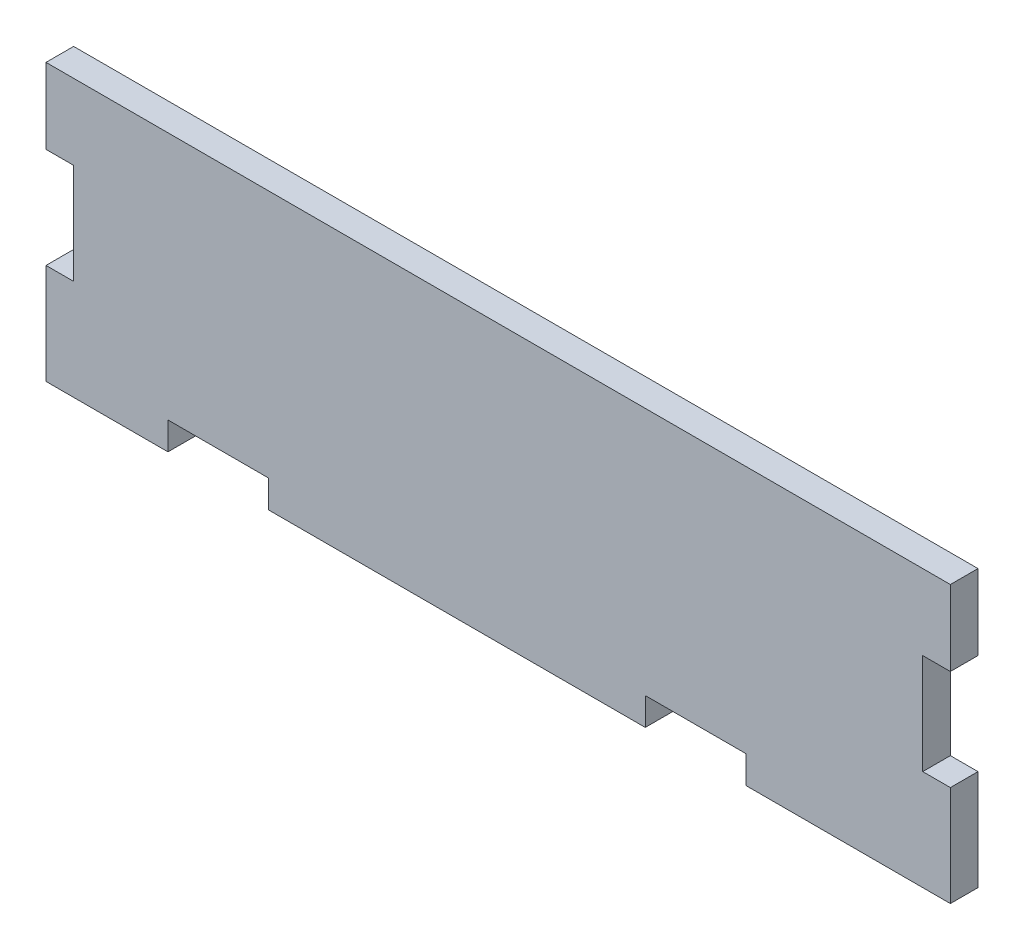
ISO-10303-21;
HEADER;
FILE_DESCRIPTION(('STEP AP214'),'2;1');
FILE_NAME('part.step','',(''),(''),'','','');
FILE_SCHEMA(('AUTOMOTIVE_DESIGN { 1 0 10303 214 1 1 1 1 }'));
ENDSEC;
DATA;
#1=APPLICATION_CONTEXT('core data for automotive mechanical design processes');
#2=APPLICATION_PROTOCOL_DEFINITION('international standard','automotive_design',2000,#1);
#3=PRODUCT_CONTEXT('',#1,'mechanical');
#4=PRODUCT('Part','Part','',(#3));
#5=PRODUCT_RELATED_PRODUCT_CATEGORY('part','',(#4));
#6=PRODUCT_DEFINITION_FORMATION('','',#4);
#7=PRODUCT_DEFINITION_CONTEXT('part definition',#1,'design');
#8=PRODUCT_DEFINITION('design','',#6,#7);
#9=PRODUCT_DEFINITION_SHAPE('','',#8);
#10=(LENGTH_UNIT() NAMED_UNIT(*) SI_UNIT(.MILLI.,.METRE.));
#11=(NAMED_UNIT(*) PLANE_ANGLE_UNIT() SI_UNIT($,.RADIAN.));
#12=(NAMED_UNIT(*) SI_UNIT($,.STERADIAN.) SOLID_ANGLE_UNIT());
#13=UNCERTAINTY_MEASURE_WITH_UNIT(LENGTH_MEASURE(1.E-05),#10,'distance_accuracy_value','');
#14=(GEOMETRIC_REPRESENTATION_CONTEXT(3) GLOBAL_UNCERTAINTY_ASSIGNED_CONTEXT((#13)) GLOBAL_UNIT_ASSIGNED_CONTEXT((#10,
#11,#12)) REPRESENTATION_CONTEXT('',''));
#15=CARTESIAN_POINT('',(0.,0.,0.));
#16=DIRECTION('',(0.,0.,1.));
#17=DIRECTION('',(1.,0.,0.));
#18=AXIS2_PLACEMENT_3D('',#15,#16,#17);
#19=CARTESIAN_POINT('',(8.22451854308681,20.0000000000037,5.5));
#20=DIRECTION('',(1.,0.,0.));
#21=DIRECTION('',(0.,1.,0.));
#22=AXIS2_PLACEMENT_3D('',#19,#20,#21);
#23=PLANE('',#22);
#24=DIRECTION('',(0.,-1.,0.));
#25=VECTOR('',#24,1.);
#26=CARTESIAN_POINT('',(8.22451854308681,20.0000000000037,0.));
#27=LINE('',#26,#25);
#28=CARTESIAN_POINT('',(8.22451854308681,20.0000000000037,0.));
#29=VERTEX_POINT('',#28);
#30=CARTESIAN_POINT('',(8.22451854308676,3.66330230039402E-12,0.));
#31=VERTEX_POINT('',#30);
#32=EDGE_CURVE('E213',#29,#31,#27,.T.);
#33=ORIENTED_EDGE('',*,*,#32,.T.);
#34=DIRECTION('',(0.,0.,-1.));
#35=VECTOR('',#34,1.);
#36=CARTESIAN_POINT('',(8.22451854308676,3.66330230039402E-12,5.5));
#37=LINE('',#36,#35);
#38=CARTESIAN_POINT('',(8.22451854308676,3.66330230039402E-12,5.5));
#39=VERTEX_POINT('',#38);
#40=EDGE_CURVE('E11',#39,#31,#37,.T.);
#41=ORIENTED_EDGE('',*,*,#40,.F.);
#42=DIRECTION('',(0.,-1.,0.));
#43=VECTOR('',#42,1.);
#44=CARTESIAN_POINT('',(8.22451854308681,20.0000000000037,5.5));
#45=LINE('',#44,#43);
#46=CARTESIAN_POINT('',(8.22451854308681,20.0000000000037,5.5));
#47=VERTEX_POINT('',#46);
#48=EDGE_CURVE('E252',#47,#39,#45,.T.);
#49=ORIENTED_EDGE('',*,*,#48,.F.);
#50=DIRECTION('',(0.,0.,-1.));
#51=VECTOR('',#50,1.);
#52=CARTESIAN_POINT('',(8.22451854308681,20.0000000000037,5.5));
#53=LINE('',#52,#51);
#54=EDGE_CURVE('E209',#47,#29,#53,.T.);
#55=ORIENTED_EDGE('',*,*,#54,.T.);
#56=EDGE_LOOP('',(#33,#41,#49,#55));
#57=FACE_BOUND('',#56,.T.);
#58=ADVANCED_FACE('F45',(#57),#23,.F.);
#59=CARTESIAN_POINT('',(8.22451854308676,3.66330230039402E-12,5.5));
#60=DIRECTION('',(0.,1.,0.));
#61=DIRECTION('',(-1.,0.,0.));
#62=AXIS2_PLACEMENT_3D('',#59,#60,#61);
#63=PLANE('',#62);
#64=DIRECTION('',(1.,0.,0.));
#65=VECTOR('',#64,1.);
#66=CARTESIAN_POINT('',(8.22451854308676,3.66330230039402E-12,0.));
#67=LINE('',#66,#65);
#68=CARTESIAN_POINT('',(32.5000000000004,3.66373598126302E-12,0.));
#69=VERTEX_POINT('',#68);
#70=EDGE_CURVE('E216',#31,#69,#67,.T.);
#71=ORIENTED_EDGE('',*,*,#70,.T.);
#72=DIRECTION('',(0.,0.,-1.));
#73=VECTOR('',#72,1.);
#74=CARTESIAN_POINT('',(32.5000000000004,3.66373598126302E-12,5.5));
#75=LINE('',#74,#73);
#76=CARTESIAN_POINT('',(32.5000000000004,3.66373598126302E-12,5.5));
#77=VERTEX_POINT('',#76);
#78=EDGE_CURVE('E53',#77,#69,#75,.T.);
#79=ORIENTED_EDGE('',*,*,#78,.F.);
#80=DIRECTION('',(1.,0.,0.));
#81=VECTOR('',#80,1.);
#82=CARTESIAN_POINT('',(8.22451854308676,3.66330230039402E-12,5.5));
#83=LINE('',#82,#81);
#84=EDGE_CURVE('E140',#39,#77,#83,.T.);
#85=ORIENTED_EDGE('',*,*,#84,.F.);
#86=ORIENTED_EDGE('',*,*,#40,.T.);
#87=EDGE_LOOP('',(#71,#79,#85,#86));
#88=FACE_BOUND('',#87,.T.);
#89=ADVANCED_FACE('F369',(#88),#63,.F.);
#90=CARTESIAN_POINT('',(32.5000000000004,5.50000000000302,5.5));
#91=DIRECTION('',(-1.,0.,0.));
#92=DIRECTION('',(0.,0.,1.));
#93=AXIS2_PLACEMENT_3D('',#90,#91,#92);
#94=PLANE('',#93);
#95=DIRECTION('',(0.,1.,0.));
#96=VECTOR('',#95,1.);
#97=CARTESIAN_POINT('',(32.5000000000004,5.50000000000302,0.));
#98=LINE('',#97,#96);
#99=CARTESIAN_POINT('',(32.5000000000004,5.50000000000302,0.));
#100=VERTEX_POINT('',#99);
#101=EDGE_CURVE('E218',#69,#100,#98,.T.);
#102=ORIENTED_EDGE('',*,*,#101,.T.);
#103=DIRECTION('',(0.,0.,-1.));
#104=VECTOR('',#103,1.);
#105=CARTESIAN_POINT('',(32.5000000000004,5.50000000000302,5.5));
#106=LINE('',#105,#104);
#107=CARTESIAN_POINT('',(32.5000000000004,5.50000000000302,5.5));
#108=VERTEX_POINT('',#107);
#109=EDGE_CURVE('E295',#108,#100,#106,.T.);
#110=ORIENTED_EDGE('',*,*,#109,.F.);
#111=DIRECTION('',(0.,1.,0.));
#112=VECTOR('',#111,1.);
#113=CARTESIAN_POINT('',(32.5000000000004,5.50000000000302,5.5));
#114=LINE('',#113,#112);
#115=EDGE_CURVE('E303',#77,#108,#114,.T.);
#116=ORIENTED_EDGE('',*,*,#115,.F.);
#117=ORIENTED_EDGE('',*,*,#78,.T.);
#118=EDGE_LOOP('',(#102,#110,#116,#117));
#119=FACE_BOUND('',#118,.T.);
#120=ADVANCED_FACE('F301',(#119),#94,.F.);
#121=CARTESIAN_POINT('',(32.5000000000004,5.50000000000302,5.5));
#122=DIRECTION('',(0.,1.,0.));
#123=DIRECTION('',(0.,0.,1.));
#124=AXIS2_PLACEMENT_3D('',#121,#122,#123);
#125=PLANE('',#124);
#126=DIRECTION('',(1.,0.,0.));
#127=VECTOR('',#126,1.);
#128=CARTESIAN_POINT('',(32.5000000000004,5.50000000000302,0.));
#129=LINE('',#128,#127);
#130=CARTESIAN_POINT('',(52.5000000000004,5.50000000000302,0.));
#131=VERTEX_POINT('',#130);
#132=EDGE_CURVE('E220',#100,#131,#129,.T.);
#133=ORIENTED_EDGE('',*,*,#132,.T.);
#134=DIRECTION('',(0.,0.,-1.));
#135=VECTOR('',#134,1.);
#136=CARTESIAN_POINT('',(52.5000000000004,5.50000000000302,5.5));
#137=LINE('',#136,#135);
#138=CARTESIAN_POINT('',(52.5000000000004,5.50000000000302,5.5));
#139=VERTEX_POINT('',#138);
#140=EDGE_CURVE('E292',#139,#131,#137,.T.);
#141=ORIENTED_EDGE('',*,*,#140,.F.);
#142=DIRECTION('',(1.,0.,0.));
#143=VECTOR('',#142,1.);
#144=CARTESIAN_POINT('',(32.5000000000004,5.50000000000302,5.5));
#145=LINE('',#144,#143);
#146=EDGE_CURVE('E320',#108,#139,#145,.T.);
#147=ORIENTED_EDGE('',*,*,#146,.F.);
#148=ORIENTED_EDGE('',*,*,#109,.T.);
#149=EDGE_LOOP('',(#133,#141,#147,#148));
#150=FACE_BOUND('',#149,.T.);
#151=ADVANCED_FACE('F311',(#150),#125,.F.);
#152=CARTESIAN_POINT('',(52.5000000000004,5.50000000000302,5.5));
#153=DIRECTION('',(1.,0.,0.));
#154=DIRECTION('',(0.,0.,-1.));
#155=AXIS2_PLACEMENT_3D('',#152,#153,#154);
#156=PLANE('',#155);
#157=DIRECTION('',(0.,-1.,0.));
#158=VECTOR('',#157,1.);
#159=CARTESIAN_POINT('',(52.5000000000004,5.50000000000302,0.));
#160=LINE('',#159,#158);
#161=CARTESIAN_POINT('',(52.5000000000004,3.66330230039402E-12,0.));
#162=VERTEX_POINT('',#161);
#163=EDGE_CURVE('E222',#131,#162,#160,.T.);
#164=ORIENTED_EDGE('',*,*,#163,.T.);
#165=DIRECTION('',(0.,0.,-1.));
#166=VECTOR('',#165,1.);
#167=CARTESIAN_POINT('',(52.5000000000004,3.66330230039402E-12,5.5));
#168=LINE('',#167,#166);
#169=CARTESIAN_POINT('',(52.5000000000004,3.66330230039402E-12,5.5));
#170=VERTEX_POINT('',#169);
#171=EDGE_CURVE('E289',#170,#162,#168,.T.);
#172=ORIENTED_EDGE('',*,*,#171,.F.);
#173=DIRECTION('',(0.,-1.,0.));
#174=VECTOR('',#173,1.);
#175=CARTESIAN_POINT('',(52.5000000000004,5.50000000000302,5.5));
#176=LINE('',#175,#174);
#177=EDGE_CURVE('E317',#139,#170,#176,.T.);
#178=ORIENTED_EDGE('',*,*,#177,.F.);
#179=ORIENTED_EDGE('',*,*,#140,.T.);
#180=EDGE_LOOP('',(#164,#172,#178,#179));
#181=FACE_BOUND('',#180,.T.);
#182=ADVANCED_FACE('F315',(#181),#156,.F.);
#183=CARTESIAN_POINT('',(100.,3.66330230039402E-12,5.5));
#184=DIRECTION('',(0.,1.,0.));
#185=DIRECTION('',(-1.,0.,0.));
#186=AXIS2_PLACEMENT_3D('',#183,#184,#185);
#187=PLANE('',#186);
#188=DIRECTION('',(1.,0.,0.));
#189=VECTOR('',#188,1.);
#190=CARTESIAN_POINT('',(100.,3.66330230039402E-12,0.));
#191=LINE('',#190,#189);
#192=CARTESIAN_POINT('',(127.5,3.66373598126302E-12,0.));
#193=VERTEX_POINT('',#192);
#194=EDGE_CURVE('E225',#162,#193,#191,.T.);
#195=ORIENTED_EDGE('',*,*,#194,.T.);
#196=DIRECTION('',(0.,0.,-1.));
#197=VECTOR('',#196,1.);
#198=CARTESIAN_POINT('',(127.5,3.66373598126302E-12,5.5));
#199=LINE('',#198,#197);
#200=CARTESIAN_POINT('',(127.5,3.66373598126302E-12,5.5));
#201=VERTEX_POINT('',#200);
#202=EDGE_CURVE('E286',#201,#193,#199,.T.);
#203=ORIENTED_EDGE('',*,*,#202,.F.);
#204=DIRECTION('',(1.,0.,0.));
#205=VECTOR('',#204,1.);
#206=CARTESIAN_POINT('',(52.5000000000004,3.66330230039402E-12,5.5));
#207=LINE('',#206,#205);
#208=EDGE_CURVE('E319',#170,#201,#207,.T.);
#209=ORIENTED_EDGE('',*,*,#208,.F.);
#210=ORIENTED_EDGE('',*,*,#171,.T.);
#211=EDGE_LOOP('',(#195,#203,#209,#210));
#212=FACE_BOUND('',#211,.T.);
#213=ADVANCED_FACE('F383',(#212),#187,.F.);
#214=CARTESIAN_POINT('',(127.5,5.50000000000303,5.5));
#215=DIRECTION('',(-1.,0.,0.));
#216=DIRECTION('',(0.,0.,1.));
#217=AXIS2_PLACEMENT_3D('',#214,#215,#216);
#218=PLANE('',#217);
#219=DIRECTION('',(0.,1.,0.));
#220=VECTOR('',#219,1.);
#221=CARTESIAN_POINT('',(127.5,5.50000000000303,0.));
#222=LINE('',#221,#220);
#223=CARTESIAN_POINT('',(127.5,5.50000000000303,0.));
#224=VERTEX_POINT('',#223);
#225=EDGE_CURVE('E227',#193,#224,#222,.T.);
#226=ORIENTED_EDGE('',*,*,#225,.T.);
#227=DIRECTION('',(0.,0.,-1.));
#228=VECTOR('',#227,1.);
#229=CARTESIAN_POINT('',(127.5,5.50000000000303,5.5));
#230=LINE('',#229,#228);
#231=CARTESIAN_POINT('',(127.5,5.50000000000303,5.5));
#232=VERTEX_POINT('',#231);
#233=EDGE_CURVE('E283',#232,#224,#230,.T.);
#234=ORIENTED_EDGE('',*,*,#233,.F.);
#235=DIRECTION('',(0.,1.,0.));
#236=VECTOR('',#235,1.);
#237=CARTESIAN_POINT('',(127.5,5.50000000000303,5.5));
#238=LINE('',#237,#236);
#239=EDGE_CURVE('E322',#201,#232,#238,.T.);
#240=ORIENTED_EDGE('',*,*,#239,.F.);
#241=ORIENTED_EDGE('',*,*,#202,.T.);
#242=EDGE_LOOP('',(#226,#234,#240,#241));
#243=FACE_BOUND('',#242,.T.);
#244=ADVANCED_FACE('F385',(#243),#218,.F.);
#245=CARTESIAN_POINT('',(127.5,5.50000000000303,5.5));
#246=DIRECTION('',(0.,1.,0.));
#247=DIRECTION('',(0.,0.,1.));
#248=AXIS2_PLACEMENT_3D('',#245,#246,#247);
#249=PLANE('',#248);
#250=DIRECTION('',(1.,0.,0.));
#251=VECTOR('',#250,1.);
#252=CARTESIAN_POINT('',(127.5,5.50000000000303,0.));
#253=LINE('',#252,#251);
#254=CARTESIAN_POINT('',(147.5,5.50000000000303,0.));
#255=VERTEX_POINT('',#254);
#256=EDGE_CURVE('E229',#224,#255,#253,.T.);
#257=ORIENTED_EDGE('',*,*,#256,.T.);
#258=DIRECTION('',(0.,0.,-1.));
#259=VECTOR('',#258,1.);
#260=CARTESIAN_POINT('',(147.5,5.50000000000303,5.5));
#261=LINE('',#260,#259);
#262=CARTESIAN_POINT('',(147.5,5.50000000000303,5.5));
#263=VERTEX_POINT('',#262);
#264=EDGE_CURVE('E280',#263,#255,#261,.T.);
#265=ORIENTED_EDGE('',*,*,#264,.F.);
#266=DIRECTION('',(1.,0.,0.));
#267=VECTOR('',#266,1.);
#268=CARTESIAN_POINT('',(127.5,5.50000000000303,5.5));
#269=LINE('',#268,#267);
#270=EDGE_CURVE('E328',#232,#263,#269,.T.);
#271=ORIENTED_EDGE('',*,*,#270,.F.);
#272=ORIENTED_EDGE('',*,*,#233,.T.);
#273=EDGE_LOOP('',(#257,#265,#271,#272));
#274=FACE_BOUND('',#273,.T.);
#275=ADVANCED_FACE('F389',(#274),#249,.F.);
#276=CARTESIAN_POINT('',(147.5,5.50000000000303,5.5));
#277=DIRECTION('',(1.,0.,0.));
#278=DIRECTION('',(0.,0.,-1.));
#279=AXIS2_PLACEMENT_3D('',#276,#277,#278);
#280=PLANE('',#279);
#281=DIRECTION('',(0.,-1.,0.));
#282=VECTOR('',#281,1.);
#283=CARTESIAN_POINT('',(147.5,5.50000000000303,0.));
#284=LINE('',#283,#282);
#285=CARTESIAN_POINT('',(147.5,3.66330230039402E-12,0.));
#286=VERTEX_POINT('',#285);
#287=EDGE_CURVE('E231',#255,#286,#284,.T.);
#288=ORIENTED_EDGE('',*,*,#287,.T.);
#289=DIRECTION('',(0.,0.,-1.));
#290=VECTOR('',#289,1.);
#291=CARTESIAN_POINT('',(147.5,3.66330230039402E-12,5.5));
#292=LINE('',#291,#290);
#293=CARTESIAN_POINT('',(147.5,3.66330230039402E-12,5.5));
#294=VERTEX_POINT('',#293);
#295=EDGE_CURVE('E277',#294,#286,#292,.T.);
#296=ORIENTED_EDGE('',*,*,#295,.F.);
#297=DIRECTION('',(0.,-1.,0.));
#298=VECTOR('',#297,1.);
#299=CARTESIAN_POINT('',(147.5,5.50000000000303,5.5));
#300=LINE('',#299,#298);
#301=EDGE_CURVE('E330',#263,#294,#300,.T.);
#302=ORIENTED_EDGE('',*,*,#301,.F.);
#303=ORIENTED_EDGE('',*,*,#264,.T.);
#304=EDGE_LOOP('',(#288,#296,#302,#303));
#305=FACE_BOUND('',#304,.T.);
#306=ADVANCED_FACE('F393',(#305),#280,.F.);
#307=CARTESIAN_POINT('',(147.5,3.66330230039402E-12,5.5));
#308=DIRECTION('',(0.,1.,0.));
#309=DIRECTION('',(0.,0.,1.));
#310=AXIS2_PLACEMENT_3D('',#307,#308,#309);
#311=PLANE('',#310);
#312=DIRECTION('',(1.,0.,0.));
#313=VECTOR('',#312,1.);
#314=CARTESIAN_POINT('',(147.5,3.66330230039402E-12,0.));
#315=LINE('',#314,#313);
#316=CARTESIAN_POINT('',(188.224518543087,3.66330230039402E-12,0.));
#317=VERTEX_POINT('',#316);
#318=EDGE_CURVE('E233',#286,#317,#315,.T.);
#319=ORIENTED_EDGE('',*,*,#318,.T.);
#320=DIRECTION('',(0.,0.,-1.));
#321=VECTOR('',#320,1.);
#322=CARTESIAN_POINT('',(188.224518543087,3.66330230039402E-12,5.5));
#323=LINE('',#322,#321);
#324=CARTESIAN_POINT('',(188.224518543087,3.66330230039402E-12,5.5));
#325=VERTEX_POINT('',#324);
#326=EDGE_CURVE('E274',#325,#317,#323,.T.);
#327=ORIENTED_EDGE('',*,*,#326,.F.);
#328=DIRECTION('',(1.,0.,0.));
#329=VECTOR('',#328,1.);
#330=CARTESIAN_POINT('',(147.5,3.66330230039402E-12,5.5));
#331=LINE('',#330,#329);
#332=EDGE_CURVE('E332',#294,#325,#331,.T.);
#333=ORIENTED_EDGE('',*,*,#332,.F.);
#334=ORIENTED_EDGE('',*,*,#295,.T.);
#335=EDGE_LOOP('',(#319,#327,#333,#334));
#336=FACE_BOUND('',#335,.T.);
#337=ADVANCED_FACE('F397',(#336),#311,.F.);
#338=CARTESIAN_POINT('',(188.224518543087,3.66330230039402E-12,5.5));
#339=DIRECTION('',(-1.,0.,0.));
#340=DIRECTION('',(0.,0.,1.));
#341=AXIS2_PLACEMENT_3D('',#338,#339,#340);
#342=PLANE('',#341);
#343=DIRECTION('',(0.,1.,0.));
#344=VECTOR('',#343,1.);
#345=CARTESIAN_POINT('',(188.224518543087,3.66330230039402E-12,0.));
#346=LINE('',#345,#344);
#347=CARTESIAN_POINT('',(188.224518543087,19.9999999999999,0.));
#348=VERTEX_POINT('',#347);
#349=EDGE_CURVE('E235',#317,#348,#346,.T.);
#350=ORIENTED_EDGE('',*,*,#349,.T.);
#351=DIRECTION('',(0.,0.,-1.));
#352=VECTOR('',#351,1.);
#353=CARTESIAN_POINT('',(188.224518543087,19.9999999999999,5.5));
#354=LINE('',#353,#352);
#355=CARTESIAN_POINT('',(188.224518543087,19.9999999999999,5.5));
#356=VERTEX_POINT('',#355);
#357=EDGE_CURVE('E271',#356,#348,#354,.T.);
#358=ORIENTED_EDGE('',*,*,#357,.F.);
#359=DIRECTION('',(0.,1.,0.));
#360=VECTOR('',#359,1.);
#361=CARTESIAN_POINT('',(188.224518543087,3.66330230039402E-12,5.5));
#362=LINE('',#361,#360);
#363=EDGE_CURVE('E334',#325,#356,#362,.T.);
#364=ORIENTED_EDGE('',*,*,#363,.F.);
#365=ORIENTED_EDGE('',*,*,#326,.T.);
#366=EDGE_LOOP('',(#350,#358,#364,#365));
#367=FACE_BOUND('',#366,.T.);
#368=ADVANCED_FACE('F401',(#367),#342,.F.);
#369=CARTESIAN_POINT('',(182.724518543087,19.9999999999999,5.5));
#370=DIRECTION('',(0.,-1.,0.));
#371=DIRECTION('',(0.,0.,-1.));
#372=AXIS2_PLACEMENT_3D('',#369,#370,#371);
#373=PLANE('',#372);
#374=DIRECTION('',(-1.,0.,0.));
#375=VECTOR('',#374,1.);
#376=CARTESIAN_POINT('',(182.724518543087,19.9999999999999,0.));
#377=LINE('',#376,#375);
#378=CARTESIAN_POINT('',(182.724518543087,19.9999999999999,0.));
#379=VERTEX_POINT('',#378);
#380=EDGE_CURVE('E237',#348,#379,#377,.T.);
#381=ORIENTED_EDGE('',*,*,#380,.T.);
#382=DIRECTION('',(0.,0.,-1.));
#383=VECTOR('',#382,1.);
#384=CARTESIAN_POINT('',(182.724518543087,19.9999999999999,5.5));
#385=LINE('',#384,#383);
#386=CARTESIAN_POINT('',(182.724518543087,19.9999999999999,5.5));
#387=VERTEX_POINT('',#386);
#388=EDGE_CURVE('E268',#387,#379,#385,.T.);
#389=ORIENTED_EDGE('',*,*,#388,.F.);
#390=DIRECTION('',(-1.,0.,0.));
#391=VECTOR('',#390,1.);
#392=CARTESIAN_POINT('',(182.724518543087,19.9999999999999,5.5));
#393=LINE('',#392,#391);
#394=EDGE_CURVE('E336',#356,#387,#393,.T.);
#395=ORIENTED_EDGE('',*,*,#394,.F.);
#396=ORIENTED_EDGE('',*,*,#357,.T.);
#397=EDGE_LOOP('',(#381,#389,#395,#396));
#398=FACE_BOUND('',#397,.T.);
#399=ADVANCED_FACE('F405',(#398),#373,.F.);
#400=CARTESIAN_POINT('',(182.724518543087,39.9999999999999,5.5));
#401=DIRECTION('',(-1.,0.,0.));
#402=DIRECTION('',(0.,-1.,0.));
#403=AXIS2_PLACEMENT_3D('',#400,#401,#402);
#404=PLANE('',#403);
#405=DIRECTION('',(0.,1.,0.));
#406=VECTOR('',#405,1.);
#407=CARTESIAN_POINT('',(182.724518543087,39.9999999999999,0.));
#408=LINE('',#407,#406);
#409=CARTESIAN_POINT('',(182.724518543087,39.9999999999999,0.));
#410=VERTEX_POINT('',#409);
#411=EDGE_CURVE('E239',#379,#410,#408,.T.);
#412=ORIENTED_EDGE('',*,*,#411,.T.);
#413=DIRECTION('',(0.,0.,-1.));
#414=VECTOR('',#413,1.);
#415=CARTESIAN_POINT('',(182.724518543087,39.9999999999999,5.5));
#416=LINE('',#415,#414);
#417=CARTESIAN_POINT('',(182.724518543087,39.9999999999999,5.5));
#418=VERTEX_POINT('',#417);
#419=EDGE_CURVE('E265',#418,#410,#416,.T.);
#420=ORIENTED_EDGE('',*,*,#419,.F.);
#421=DIRECTION('',(0.,1.,0.));
#422=VECTOR('',#421,1.);
#423=CARTESIAN_POINT('',(182.724518543087,39.9999999999999,5.5));
#424=LINE('',#423,#422);
#425=EDGE_CURVE('E338',#387,#418,#424,.T.);
#426=ORIENTED_EDGE('',*,*,#425,.F.);
#427=ORIENTED_EDGE('',*,*,#388,.T.);
#428=EDGE_LOOP('',(#412,#420,#426,#427));
#429=FACE_BOUND('',#428,.T.);
#430=ADVANCED_FACE('F409',(#429),#404,.F.);
#431=CARTESIAN_POINT('',(182.724518543087,39.9999999999999,5.5));
#432=DIRECTION('',(0.,1.,0.));
#433=DIRECTION('',(0.,0.,1.));
#434=AXIS2_PLACEMENT_3D('',#431,#432,#433);
#435=PLANE('',#434);
#436=DIRECTION('',(1.,0.,0.));
#437=VECTOR('',#436,1.);
#438=CARTESIAN_POINT('',(182.724518543087,39.9999999999999,0.));
#439=LINE('',#438,#437);
#440=CARTESIAN_POINT('',(188.224518543087,39.9999999999999,0.));
#441=VERTEX_POINT('',#440);
#442=EDGE_CURVE('E241',#410,#441,#439,.T.);
#443=ORIENTED_EDGE('',*,*,#442,.T.);
#444=DIRECTION('',(0.,0.,-1.));
#445=VECTOR('',#444,1.);
#446=CARTESIAN_POINT('',(188.224518543087,39.9999999999999,5.5));
#447=LINE('',#446,#445);
#448=CARTESIAN_POINT('',(188.224518543087,39.9999999999999,5.5));
#449=VERTEX_POINT('',#448);
#450=EDGE_CURVE('E262',#449,#441,#447,.T.);
#451=ORIENTED_EDGE('',*,*,#450,.F.);
#452=DIRECTION('',(1.,0.,0.));
#453=VECTOR('',#452,1.);
#454=CARTESIAN_POINT('',(182.724518543087,39.9999999999999,5.5));
#455=LINE('',#454,#453);
#456=EDGE_CURVE('E340',#418,#449,#455,.T.);
#457=ORIENTED_EDGE('',*,*,#456,.F.);
#458=ORIENTED_EDGE('',*,*,#419,.T.);
#459=EDGE_LOOP('',(#443,#451,#457,#458));
#460=FACE_BOUND('',#459,.T.);
#461=ADVANCED_FACE('F413',(#460),#435,.F.);
#462=CARTESIAN_POINT('',(188.224518543087,39.9999999999999,5.5));
#463=DIRECTION('',(-1.,0.,0.));
#464=DIRECTION('',(0.,0.,1.));
#465=AXIS2_PLACEMENT_3D('',#462,#463,#464);
#466=PLANE('',#465);
#467=DIRECTION('',(0.,1.,0.));
#468=VECTOR('',#467,1.);
#469=CARTESIAN_POINT('',(188.224518543087,39.9999999999999,0.));
#470=LINE('',#469,#468);
#471=CARTESIAN_POINT('',(188.224518543087,55.0000000000037,0.));
#472=VERTEX_POINT('',#471);
#473=EDGE_CURVE('E243',#441,#472,#470,.T.);
#474=ORIENTED_EDGE('',*,*,#473,.T.);
#475=DIRECTION('',(0.,0.,-1.));
#476=VECTOR('',#475,1.);
#477=CARTESIAN_POINT('',(188.224518543087,55.0000000000037,5.5));
#478=LINE('',#477,#476);
#479=CARTESIAN_POINT('',(188.224518543087,55.0000000000037,5.5));
#480=VERTEX_POINT('',#479);
#481=EDGE_CURVE('E259',#480,#472,#478,.T.);
#482=ORIENTED_EDGE('',*,*,#481,.F.);
#483=DIRECTION('',(0.,1.,0.));
#484=VECTOR('',#483,1.);
#485=CARTESIAN_POINT('',(188.224518543087,39.9999999999999,5.5));
#486=LINE('',#485,#484);
#487=EDGE_CURVE('E342',#449,#480,#486,.T.);
#488=ORIENTED_EDGE('',*,*,#487,.F.);
#489=ORIENTED_EDGE('',*,*,#450,.T.);
#490=EDGE_LOOP('',(#474,#482,#488,#489));
#491=FACE_BOUND('',#490,.T.);
#492=ADVANCED_FACE('F417',(#491),#466,.F.);
#493=CARTESIAN_POINT('',(8.22451854308676,55.0000000000037,5.5));
#494=DIRECTION('',(0.,-1.,0.));
#495=DIRECTION('',(0.,0.,-1.));
#496=AXIS2_PLACEMENT_3D('',#493,#494,#495);
#497=PLANE('',#496);
#498=DIRECTION('',(-1.,0.,0.));
#499=VECTOR('',#498,1.);
#500=CARTESIAN_POINT('',(8.22451854308676,55.0000000000037,0.));
#501=LINE('',#500,#499);
#502=CARTESIAN_POINT('',(8.22451854308676,55.0000000000037,0.));
#503=VERTEX_POINT('',#502);
#504=EDGE_CURVE('E245',#472,#503,#501,.T.);
#505=ORIENTED_EDGE('',*,*,#504,.T.);
#506=DIRECTION('',(0.,0.,-1.));
#507=VECTOR('',#506,1.);
#508=CARTESIAN_POINT('',(8.22451854308676,55.0000000000037,5.5));
#509=LINE('',#508,#507);
#510=CARTESIAN_POINT('',(8.22451854308676,55.0000000000037,5.5));
#511=VERTEX_POINT('',#510);
#512=EDGE_CURVE('E256',#511,#503,#509,.T.);
#513=ORIENTED_EDGE('',*,*,#512,.F.);
#514=DIRECTION('',(-1.,0.,0.));
#515=VECTOR('',#514,1.);
#516=CARTESIAN_POINT('',(8.22451854308676,55.0000000000037,5.5));
#517=LINE('',#516,#515);
#518=EDGE_CURVE('E344',#480,#511,#517,.T.);
#519=ORIENTED_EDGE('',*,*,#518,.F.);
#520=ORIENTED_EDGE('',*,*,#481,.T.);
#521=EDGE_LOOP('',(#505,#513,#519,#520));
#522=FACE_BOUND('',#521,.T.);
#523=ADVANCED_FACE('F350',(#522),#497,.F.);
#524=CARTESIAN_POINT('',(8.22451854308676,55.0000000000037,5.5));
#525=DIRECTION('',(1.,0.,0.));
#526=DIRECTION('',(0.,1.,0.));
#527=AXIS2_PLACEMENT_3D('',#524,#525,#526);
#528=PLANE('',#527);
#529=DIRECTION('',(0.,-1.,0.));
#530=VECTOR('',#529,1.);
#531=CARTESIAN_POINT('',(8.22451854308676,55.0000000000037,0.));
#532=LINE('',#531,#530);
#533=CARTESIAN_POINT('',(8.22451854308681,40.0000000000037,0.));
#534=VERTEX_POINT('',#533);
#535=EDGE_CURVE('E247',#503,#534,#532,.T.);
#536=ORIENTED_EDGE('',*,*,#535,.T.);
#537=DIRECTION('',(0.,0.,-1.));
#538=VECTOR('',#537,1.);
#539=CARTESIAN_POINT('',(8.22451854308681,40.0000000000037,5.5));
#540=LINE('',#539,#538);
#541=CARTESIAN_POINT('',(8.22451854308681,40.0000000000037,5.5));
#542=VERTEX_POINT('',#541);
#543=EDGE_CURVE('E204',#542,#534,#540,.T.);
#544=ORIENTED_EDGE('',*,*,#543,.F.);
#545=DIRECTION('',(0.,-1.,0.));
#546=VECTOR('',#545,1.);
#547=CARTESIAN_POINT('',(8.22451854308676,55.0000000000037,5.5));
#548=LINE('',#547,#546);
#549=EDGE_CURVE('E195',#511,#542,#548,.T.);
#550=ORIENTED_EDGE('',*,*,#549,.F.);
#551=ORIENTED_EDGE('',*,*,#512,.T.);
#552=EDGE_LOOP('',(#536,#544,#550,#551));
#553=FACE_BOUND('',#552,.T.);
#554=ADVANCED_FACE('F354',(#553),#528,.F.);
#555=CARTESIAN_POINT('',(8.22451854308681,40.0000000000037,5.5));
#556=DIRECTION('',(0.,1.,0.));
#557=DIRECTION('',(0.,0.,1.));
#558=AXIS2_PLACEMENT_3D('',#555,#556,#557);
#559=PLANE('',#558);
#560=DIRECTION('',(1.,0.,0.));
#561=VECTOR('',#560,1.);
#562=CARTESIAN_POINT('',(8.22451854308681,40.0000000000037,0.));
#563=LINE('',#562,#561);
#564=CARTESIAN_POINT('',(13.7245185430868,40.0000000000037,0.));
#565=VERTEX_POINT('',#564);
#566=EDGE_CURVE('E203',#534,#565,#563,.T.);
#567=ORIENTED_EDGE('',*,*,#566,.T.);
#568=DIRECTION('',(0.,0.,-1.));
#569=VECTOR('',#568,1.);
#570=CARTESIAN_POINT('',(13.7245185430868,40.0000000000037,5.5));
#571=LINE('',#570,#569);
#572=CARTESIAN_POINT('',(13.7245185430868,40.0000000000037,5.5));
#573=VERTEX_POINT('',#572);
#574=EDGE_CURVE('E200',#573,#565,#571,.T.);
#575=ORIENTED_EDGE('',*,*,#574,.F.);
#576=DIRECTION('',(1.,0.,0.));
#577=VECTOR('',#576,1.);
#578=CARTESIAN_POINT('',(8.22451854308681,40.0000000000037,5.5));
#579=LINE('',#578,#577);
#580=EDGE_CURVE('E189',#542,#573,#579,.T.);
#581=ORIENTED_EDGE('',*,*,#580,.F.);
#582=ORIENTED_EDGE('',*,*,#543,.T.);
#583=EDGE_LOOP('',(#567,#575,#581,#582));
#584=FACE_BOUND('',#583,.T.);
#585=ADVANCED_FACE('F201',(#584),#559,.F.);
#586=CARTESIAN_POINT('',(13.7245185430868,40.0000000000037,5.5));
#587=DIRECTION('',(1.,0.,0.));
#588=DIRECTION('',(0.,1.,0.));
#589=AXIS2_PLACEMENT_3D('',#586,#587,#588);
#590=PLANE('',#589);
#591=DIRECTION('',(0.,-1.,0.));
#592=VECTOR('',#591,1.);
#593=CARTESIAN_POINT('',(13.7245185430868,40.0000000000037,0.));
#594=LINE('',#593,#592);
#595=CARTESIAN_POINT('',(13.7245185430868,20.0000000000037,0.));
#596=VERTEX_POINT('',#595);
#597=EDGE_CURVE('E126',#565,#596,#594,.T.);
#598=ORIENTED_EDGE('',*,*,#597,.T.);
#599=DIRECTION('',(0.,0.,-1.));
#600=VECTOR('',#599,1.);
#601=CARTESIAN_POINT('',(13.7245185430868,20.0000000000037,5.5));
#602=LINE('',#601,#600);
#603=CARTESIAN_POINT('',(13.7245185430868,20.0000000000037,5.5));
#604=VERTEX_POINT('',#603);
#605=EDGE_CURVE('E205',#604,#596,#602,.T.);
#606=ORIENTED_EDGE('',*,*,#605,.F.);
#607=DIRECTION('',(0.,-1.,0.));
#608=VECTOR('',#607,1.);
#609=CARTESIAN_POINT('',(13.7245185430868,40.0000000000037,5.5));
#610=LINE('',#609,#608);
#611=EDGE_CURVE('E193',#573,#604,#610,.T.);
#612=ORIENTED_EDGE('',*,*,#611,.F.);
#613=ORIENTED_EDGE('',*,*,#574,.T.);
#614=EDGE_LOOP('',(#598,#606,#612,#613));
#615=FACE_BOUND('',#614,.T.);
#616=ADVANCED_FACE('F207',(#615),#590,.F.);
#617=CARTESIAN_POINT('',(13.7245185430868,20.0000000000037,5.5));
#618=DIRECTION('',(0.,-1.,0.));
#619=DIRECTION('',(0.,0.,-1.));
#620=AXIS2_PLACEMENT_3D('',#617,#618,#619);
#621=PLANE('',#620);
#622=DIRECTION('',(-1.,0.,0.));
#623=VECTOR('',#622,1.);
#624=CARTESIAN_POINT('',(13.7245185430868,20.0000000000037,0.));
#625=LINE('',#624,#623);
#626=EDGE_CURVE('E132',#596,#29,#625,.T.);
#627=ORIENTED_EDGE('',*,*,#626,.T.);
#628=ORIENTED_EDGE('',*,*,#54,.F.);
#629=DIRECTION('',(-1.,0.,0.));
#630=VECTOR('',#629,1.);
#631=CARTESIAN_POINT('',(13.7245185430868,20.0000000000037,5.5));
#632=LINE('',#631,#630);
#633=EDGE_CURVE('E61',#604,#47,#632,.T.);
#634=ORIENTED_EDGE('',*,*,#633,.F.);
#635=ORIENTED_EDGE('',*,*,#605,.T.);
#636=EDGE_LOOP('',(#627,#628,#634,#635));
#637=FACE_BOUND('',#636,.T.);
#638=ADVANCED_FACE('F358',(#637),#621,.F.);
#639=CARTESIAN_POINT('',(0.,0.,5.5));
#640=DIRECTION('',(0.,0.,1.));
#641=DIRECTION('',(1.,0.,0.));
#642=AXIS2_PLACEMENT_3D('',#639,#640,#641);
#643=PLANE('',#642);
#644=ORIENTED_EDGE('',*,*,#48,.T.);
#645=ORIENTED_EDGE('',*,*,#84,.T.);
#646=ORIENTED_EDGE('',*,*,#115,.T.);
#647=ORIENTED_EDGE('',*,*,#146,.T.);
#648=ORIENTED_EDGE('',*,*,#177,.T.);
#649=ORIENTED_EDGE('',*,*,#208,.T.);
#650=ORIENTED_EDGE('',*,*,#239,.T.);
#651=ORIENTED_EDGE('',*,*,#270,.T.);
#652=ORIENTED_EDGE('',*,*,#301,.T.);
#653=ORIENTED_EDGE('',*,*,#332,.T.);
#654=ORIENTED_EDGE('',*,*,#363,.T.);
#655=ORIENTED_EDGE('',*,*,#394,.T.);
#656=ORIENTED_EDGE('',*,*,#425,.T.);
#657=ORIENTED_EDGE('',*,*,#456,.T.);
#658=ORIENTED_EDGE('',*,*,#487,.T.);
#659=ORIENTED_EDGE('',*,*,#518,.T.);
#660=ORIENTED_EDGE('',*,*,#549,.T.);
#661=ORIENTED_EDGE('',*,*,#580,.T.);
#662=ORIENTED_EDGE('',*,*,#611,.T.);
#663=ORIENTED_EDGE('',*,*,#633,.T.);
#664=EDGE_LOOP('',(#644,#645,#646,#647,#648,#649,#650,#651,#652,#653,#654,#655,#656,#657,#658,
#659,#660,#661,#662,#663));
#665=FACE_BOUND('',#664,.T.);
#666=ADVANCED_FACE('F191',(#665),#643,.T.);
#667=CARTESIAN_POINT('',(0.,0.,0.));
#668=DIRECTION('',(0.,0.,1.));
#669=DIRECTION('',(1.,0.,0.));
#670=AXIS2_PLACEMENT_3D('',#667,#668,#669);
#671=PLANE('',#670);
#672=ORIENTED_EDGE('',*,*,#32,.F.);
#673=ORIENTED_EDGE('',*,*,#626,.F.);
#674=ORIENTED_EDGE('',*,*,#597,.F.);
#675=ORIENTED_EDGE('',*,*,#566,.F.);
#676=ORIENTED_EDGE('',*,*,#535,.F.);
#677=ORIENTED_EDGE('',*,*,#504,.F.);
#678=ORIENTED_EDGE('',*,*,#473,.F.);
#679=ORIENTED_EDGE('',*,*,#442,.F.);
#680=ORIENTED_EDGE('',*,*,#411,.F.);
#681=ORIENTED_EDGE('',*,*,#380,.F.);
#682=ORIENTED_EDGE('',*,*,#349,.F.);
#683=ORIENTED_EDGE('',*,*,#318,.F.);
#684=ORIENTED_EDGE('',*,*,#287,.F.);
#685=ORIENTED_EDGE('',*,*,#256,.F.);
#686=ORIENTED_EDGE('',*,*,#225,.F.);
#687=ORIENTED_EDGE('',*,*,#194,.F.);
#688=ORIENTED_EDGE('',*,*,#163,.F.);
#689=ORIENTED_EDGE('',*,*,#132,.F.);
#690=ORIENTED_EDGE('',*,*,#101,.F.);
#691=ORIENTED_EDGE('',*,*,#70,.F.);
#692=EDGE_LOOP('',(#672,#673,#674,#675,#676,#677,#678,#679,#680,#681,#682,#683,#684,#685,#686,
#687,#688,#689,#690,#691));
#693=FACE_BOUND('',#692,.T.);
#694=ADVANCED_FACE('F307',(#693),#671,.F.);
#695=CLOSED_SHELL('',(#58,#89,#120,#151,#182,#213,#244,#275,#306,#337,#368,#399,#430,#461,#492,
#523,#554,#585,#616,#638,#666,#694));
#696=MANIFOLD_SOLID_BREP('B2',#695);
#697=ADVANCED_BREP_SHAPE_REPRESENTATION('',(#18,#696),#14);
#698=SHAPE_DEFINITION_REPRESENTATION(#9,#697);
ENDSEC;
END-ISO-10303-21;
